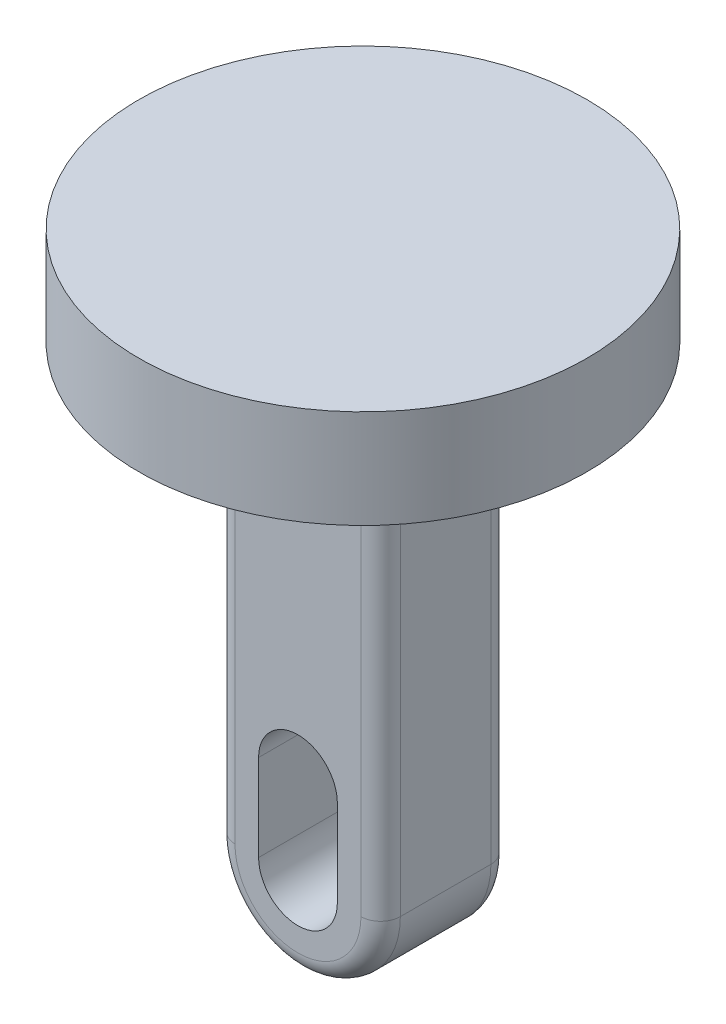
ISO-10303-21;
HEADER;
FILE_DESCRIPTION(('STEP AP214'),'2;1');
FILE_NAME('part.step','',(''),(''),'','','');
FILE_SCHEMA(('AUTOMOTIVE_DESIGN { 1 0 10303 214 1 1 1 1 }'));
ENDSEC;
DATA;
#1=APPLICATION_CONTEXT('core data for automotive mechanical design processes');
#2=APPLICATION_PROTOCOL_DEFINITION('international standard','automotive_design',2000,#1);
#3=PRODUCT_CONTEXT('',#1,'mechanical');
#4=PRODUCT('Part','Part','',(#3));
#5=PRODUCT_RELATED_PRODUCT_CATEGORY('part','',(#4));
#6=PRODUCT_DEFINITION_FORMATION('','',#4);
#7=PRODUCT_DEFINITION_CONTEXT('part definition',#1,'design');
#8=PRODUCT_DEFINITION('design','',#6,#7);
#9=PRODUCT_DEFINITION_SHAPE('','',#8);
#10=(LENGTH_UNIT() NAMED_UNIT(*) SI_UNIT(.MILLI.,.METRE.));
#11=(NAMED_UNIT(*) PLANE_ANGLE_UNIT() SI_UNIT($,.RADIAN.));
#12=(NAMED_UNIT(*) SI_UNIT($,.STERADIAN.) SOLID_ANGLE_UNIT());
#13=UNCERTAINTY_MEASURE_WITH_UNIT(LENGTH_MEASURE(1.E-05),#10,'distance_accuracy_value','');
#14=(GEOMETRIC_REPRESENTATION_CONTEXT(3) GLOBAL_UNCERTAINTY_ASSIGNED_CONTEXT((#13)) GLOBAL_UNIT_ASSIGNED_CONTEXT((#10,
#11,#12)) REPRESENTATION_CONTEXT('',''));
#15=CARTESIAN_POINT('',(0.,0.,0.));
#16=DIRECTION('',(0.,0.,1.));
#17=DIRECTION('',(1.,0.,0.));
#18=AXIS2_PLACEMENT_3D('',#15,#16,#17);
#19=CARTESIAN_POINT('',(0.,0.,1.65));
#20=DIRECTION('',(0.,0.,1.));
#21=DIRECTION('',(1.,0.,0.));
#22=AXIS2_PLACEMENT_3D('',#19,#20,#21);
#23=PLANE('',#22);
#24=CARTESIAN_POINT('',(0.,0.,1.65));
#25=DIRECTION('',(0.,0.,1.));
#26=DIRECTION('',(1.,0.,0.));
#27=AXIS2_PLACEMENT_3D('',#24,#25,#26);
#28=CIRCLE('',#27,1.6);
#29=CARTESIAN_POINT('',(-1.6,0.,1.65));
#30=VERTEX_POINT('',#29);
#31=CARTESIAN_POINT('',(1.6,0.,1.65));
#32=VERTEX_POINT('',#31);
#33=EDGE_CURVE('E185',#30,#32,#28,.T.);
#34=ORIENTED_EDGE('',*,*,#33,.T.);
#35=DIRECTION('',(0.,1.,0.));
#36=VECTOR('',#35,1.);
#37=CARTESIAN_POINT('',(1.6,9.7,1.65));
#38=LINE('',#37,#36);
#39=CARTESIAN_POINT('',(1.6,9.7,1.65));
#40=VERTEX_POINT('',#39);
#41=EDGE_CURVE('E187',#32,#40,#38,.T.);
#42=ORIENTED_EDGE('',*,*,#41,.T.);
#43=DIRECTION('',(-1.,0.,0.));
#44=VECTOR('',#43,1.);
#45=CARTESIAN_POINT('',(2.1,9.7,1.65));
#46=LINE('',#45,#44);
#47=CARTESIAN_POINT('',(-1.6,9.7,1.65));
#48=VERTEX_POINT('',#47);
#49=EDGE_CURVE('E166',#40,#48,#46,.T.);
#50=ORIENTED_EDGE('',*,*,#49,.T.);
#51=DIRECTION('',(0.,-1.,0.));
#52=VECTOR('',#51,1.);
#53=CARTESIAN_POINT('',(-1.6,0.,1.65));
#54=LINE('',#53,#52);
#55=EDGE_CURVE('E183',#48,#30,#54,.T.);
#56=ORIENTED_EDGE('',*,*,#55,.T.);
#57=EDGE_LOOP('',(#34,#42,#50,#56));
#58=FACE_BOUND('',#57,.T.);
#59=DIRECTION('',(0.,1.,0.));
#60=VECTOR('',#59,1.);
#61=CARTESIAN_POINT('',(1.,0.,1.65));
#62=LINE('',#61,#60);
#63=CARTESIAN_POINT('',(1.,0.,1.65));
#64=VERTEX_POINT('',#63);
#65=CARTESIAN_POINT('',(1.,2.2,1.65));
#66=VERTEX_POINT('',#65);
#67=EDGE_CURVE('E133',#64,#66,#62,.T.);
#68=ORIENTED_EDGE('',*,*,#67,.F.);
#69=CARTESIAN_POINT('',(0.,0.,1.65));
#70=DIRECTION('',(0.,0.,1.));
#71=DIRECTION('',(1.,0.,0.));
#72=AXIS2_PLACEMENT_3D('',#69,#70,#71);
#73=CIRCLE('',#72,1.);
#74=CARTESIAN_POINT('',(-1.,0.,1.65));
#75=VERTEX_POINT('',#74);
#76=EDGE_CURVE('E123',#75,#64,#73,.T.);
#77=ORIENTED_EDGE('',*,*,#76,.F.);
#78=DIRECTION('',(0.,-1.,0.));
#79=VECTOR('',#78,1.);
#80=CARTESIAN_POINT('',(-1.,0.,1.65));
#81=LINE('',#80,#79);
#82=CARTESIAN_POINT('',(-1.,2.2,1.65));
#83=VERTEX_POINT('',#82);
#84=EDGE_CURVE('E148',#83,#75,#81,.T.);
#85=ORIENTED_EDGE('',*,*,#84,.F.);
#86=CARTESIAN_POINT('',(0.,2.2,1.65));
#87=DIRECTION('',(0.,0.,1.));
#88=DIRECTION('',(1.,0.,0.));
#89=AXIS2_PLACEMENT_3D('',#86,#87,#88);
#90=CIRCLE('',#89,1.);
#91=EDGE_CURVE('E146',#66,#83,#90,.T.);
#92=ORIENTED_EDGE('',*,*,#91,.F.);
#93=EDGE_LOOP('',(#68,#77,#85,#92));
#94=FACE_BOUND('',#93,.T.);
#95=ADVANCED_FACE('F33',(#58,#94),#23,.T.);
#96=CARTESIAN_POINT('',(0.,0.,-1.65));
#97=DIRECTION('',(0.,0.,1.));
#98=DIRECTION('',(1.,0.,0.));
#99=AXIS2_PLACEMENT_3D('',#96,#97,#98);
#100=PLANE('',#99);
#101=DIRECTION('',(-1.,0.,0.));
#102=VECTOR('',#101,1.);
#103=CARTESIAN_POINT('',(2.1,9.7,-1.65));
#104=LINE('',#103,#102);
#105=CARTESIAN_POINT('',(1.6,9.7,-1.65));
#106=VERTEX_POINT('',#105);
#107=CARTESIAN_POINT('',(-1.6,9.7,-1.65));
#108=VERTEX_POINT('',#107);
#109=EDGE_CURVE('E141',#106,#108,#104,.T.);
#110=ORIENTED_EDGE('',*,*,#109,.F.);
#111=DIRECTION('',(0.,1.,0.));
#112=VECTOR('',#111,1.);
#113=CARTESIAN_POINT('',(1.6,0.,-1.65));
#114=LINE('',#113,#112);
#115=CARTESIAN_POINT('',(1.6,0.,-1.65));
#116=VERTEX_POINT('',#115);
#117=EDGE_CURVE('E50',#106,#116,#114,.F.);
#118=ORIENTED_EDGE('',*,*,#117,.T.);
#119=CARTESIAN_POINT('',(0.,0.,-1.65));
#120=DIRECTION('',(0.,0.,1.));
#121=DIRECTION('',(1.,0.,0.));
#122=AXIS2_PLACEMENT_3D('',#119,#120,#121);
#123=CIRCLE('',#122,1.6);
#124=CARTESIAN_POINT('',(-1.6,0.,-1.65));
#125=VERTEX_POINT('',#124);
#126=EDGE_CURVE('E54',#116,#125,#123,.F.);
#127=ORIENTED_EDGE('',*,*,#126,.T.);
#128=DIRECTION('',(0.,-1.,0.));
#129=VECTOR('',#128,1.);
#130=CARTESIAN_POINT('',(-1.6,0.,-1.65));
#131=LINE('',#130,#129);
#132=EDGE_CURVE('E207',#125,#108,#131,.F.);
#133=ORIENTED_EDGE('',*,*,#132,.T.);
#134=EDGE_LOOP('',(#110,#118,#127,#133));
#135=FACE_BOUND('',#134,.T.);
#136=CARTESIAN_POINT('',(0.,0.,-1.65));
#137=DIRECTION('',(0.,0.,1.));
#138=DIRECTION('',(1.,0.,0.));
#139=AXIS2_PLACEMENT_3D('',#136,#137,#138);
#140=CIRCLE('',#139,1.);
#141=CARTESIAN_POINT('',(-1.,0.,-1.65));
#142=VERTEX_POINT('',#141);
#143=CARTESIAN_POINT('',(1.,0.,-1.65));
#144=VERTEX_POINT('',#143);
#145=EDGE_CURVE('E153',#142,#144,#140,.T.);
#146=ORIENTED_EDGE('',*,*,#145,.T.);
#147=DIRECTION('',(0.,1.,0.));
#148=VECTOR('',#147,1.);
#149=CARTESIAN_POINT('',(1.,0.,-1.65));
#150=LINE('',#149,#148);
#151=CARTESIAN_POINT('',(1.,2.2,-1.65));
#152=VERTEX_POINT('',#151);
#153=EDGE_CURVE('E140',#144,#152,#150,.T.);
#154=ORIENTED_EDGE('',*,*,#153,.T.);
#155=CARTESIAN_POINT('',(0.,2.2,-1.65));
#156=DIRECTION('',(0.,0.,1.));
#157=DIRECTION('',(1.,0.,0.));
#158=AXIS2_PLACEMENT_3D('',#155,#156,#157);
#159=CIRCLE('',#158,1.);
#160=CARTESIAN_POINT('',(-1.,2.2,-1.65));
#161=VERTEX_POINT('',#160);
#162=EDGE_CURVE('E157',#152,#161,#159,.T.);
#163=ORIENTED_EDGE('',*,*,#162,.T.);
#164=DIRECTION('',(0.,-1.,0.));
#165=VECTOR('',#164,1.);
#166=CARTESIAN_POINT('',(-1.,0.,-1.65));
#167=LINE('',#166,#165);
#168=EDGE_CURVE('E134',#161,#142,#167,.T.);
#169=ORIENTED_EDGE('',*,*,#168,.T.);
#170=EDGE_LOOP('',(#146,#154,#163,#169));
#171=FACE_BOUND('',#170,.T.);
#172=ADVANCED_FACE('F231',(#135,#171),#100,.F.);
#173=CARTESIAN_POINT('',(-2.1,0.,1.65));
#174=DIRECTION('',(1.,0.,0.));
#175=DIRECTION('',(0.,0.,-1.));
#176=AXIS2_PLACEMENT_3D('',#173,#174,#175);
#177=PLANE('',#176);
#178=DIRECTION('',(0.,0.,-1.));
#179=VECTOR('',#178,1.);
#180=CARTESIAN_POINT('',(-2.1,0.,1.65));
#181=LINE('',#180,#179);
#182=CARTESIAN_POINT('',(-2.1,0.,1.15));
#183=VERTEX_POINT('',#182);
#184=CARTESIAN_POINT('',(-2.1,0.,-1.15));
#185=VERTEX_POINT('',#184);
#186=EDGE_CURVE('E180',#183,#185,#181,.T.);
#187=ORIENTED_EDGE('',*,*,#186,.F.);
#188=DIRECTION('',(0.,-1.,0.));
#189=VECTOR('',#188,1.);
#190=CARTESIAN_POINT('',(-2.1,9.7,1.15));
#191=LINE('',#190,#189);
#192=CARTESIAN_POINT('',(-2.1,9.7,1.15));
#193=VERTEX_POINT('',#192);
#194=EDGE_CURVE('E11',#183,#193,#191,.F.);
#195=ORIENTED_EDGE('',*,*,#194,.T.);
#196=DIRECTION('',(0.,0.,-1.));
#197=VECTOR('',#196,1.);
#198=CARTESIAN_POINT('',(-2.1,9.7,1.65));
#199=LINE('',#198,#197);
#200=CARTESIAN_POINT('',(-2.1,9.7,-1.15));
#201=VERTEX_POINT('',#200);
#202=EDGE_CURVE('E169',#193,#201,#199,.T.);
#203=ORIENTED_EDGE('',*,*,#202,.T.);
#204=DIRECTION('',(0.,-1.,0.));
#205=VECTOR('',#204,1.);
#206=CARTESIAN_POINT('',(-2.1,0.,-1.15));
#207=LINE('',#206,#205);
#208=EDGE_CURVE('E42',#201,#185,#207,.T.);
#209=ORIENTED_EDGE('',*,*,#208,.T.);
#210=EDGE_LOOP('',(#187,#195,#203,#209));
#211=FACE_BOUND('',#210,.T.);
#212=ADVANCED_FACE('F262',(#211),#177,.F.);
#213=CARTESIAN_POINT('',(0.,0.,1.65));
#214=DIRECTION('',(0.,0.,-1.));
#215=DIRECTION('',(-1.,0.,0.));
#216=AXIS2_PLACEMENT_3D('',#213,#214,#215);
#217=CYLINDRICAL_SURFACE('',#216,2.1);
#218=DIRECTION('',(0.,0.,-1.));
#219=VECTOR('',#218,1.);
#220=CARTESIAN_POINT('',(2.1,0.,1.65));
#221=LINE('',#220,#219);
#222=CARTESIAN_POINT('',(2.1,0.,1.15));
#223=VERTEX_POINT('',#222);
#224=CARTESIAN_POINT('',(2.1,0.,-1.15));
#225=VERTEX_POINT('',#224);
#226=EDGE_CURVE('E177',#223,#225,#221,.T.);
#227=ORIENTED_EDGE('',*,*,#226,.F.);
#228=CARTESIAN_POINT('',(0.,0.,1.15));
#229=DIRECTION('',(0.,0.,1.));
#230=DIRECTION('',(1.,0.,0.));
#231=AXIS2_PLACEMENT_3D('',#228,#229,#230);
#232=CIRCLE('',#231,2.1);
#233=EDGE_CURVE('E205',#223,#183,#232,.F.);
#234=ORIENTED_EDGE('',*,*,#233,.T.);
#235=ORIENTED_EDGE('',*,*,#186,.T.);
#236=CARTESIAN_POINT('',(0.,0.,-1.15));
#237=DIRECTION('',(0.,0.,1.));
#238=DIRECTION('',(1.,0.,0.));
#239=AXIS2_PLACEMENT_3D('',#236,#237,#238);
#240=CIRCLE('',#239,2.1);
#241=EDGE_CURVE('E203',#185,#225,#240,.T.);
#242=ORIENTED_EDGE('',*,*,#241,.T.);
#243=EDGE_LOOP('',(#227,#234,#235,#242));
#244=FACE_BOUND('',#243,.T.);
#245=ADVANCED_FACE('F245',(#244),#217,.T.);
#246=CARTESIAN_POINT('',(2.1,0.,1.65));
#247=DIRECTION('',(-1.,0.,0.));
#248=DIRECTION('',(0.,0.,1.));
#249=AXIS2_PLACEMENT_3D('',#246,#247,#248);
#250=PLANE('',#249);
#251=DIRECTION('',(0.,0.,-1.));
#252=VECTOR('',#251,1.);
#253=CARTESIAN_POINT('',(2.1,9.7,1.65));
#254=LINE('',#253,#252);
#255=CARTESIAN_POINT('',(2.1,9.7,1.15));
#256=VERTEX_POINT('',#255);
#257=CARTESIAN_POINT('',(2.1,9.7,-1.15));
#258=VERTEX_POINT('',#257);
#259=EDGE_CURVE('E174',#256,#258,#254,.T.);
#260=ORIENTED_EDGE('',*,*,#259,.F.);
#261=DIRECTION('',(0.,1.,0.));
#262=VECTOR('',#261,1.);
#263=CARTESIAN_POINT('',(2.1,0.,1.15));
#264=LINE('',#263,#262);
#265=EDGE_CURVE('E201',#256,#223,#264,.F.);
#266=ORIENTED_EDGE('',*,*,#265,.T.);
#267=ORIENTED_EDGE('',*,*,#226,.T.);
#268=DIRECTION('',(0.,1.,0.));
#269=VECTOR('',#268,1.);
#270=CARTESIAN_POINT('',(2.1,0.,-1.15));
#271=LINE('',#270,#269);
#272=EDGE_CURVE('E198',#225,#258,#271,.T.);
#273=ORIENTED_EDGE('',*,*,#272,.T.);
#274=EDGE_LOOP('',(#260,#266,#267,#273));
#275=FACE_BOUND('',#274,.T.);
#276=ADVANCED_FACE('F240',(#275),#250,.F.);
#277=CARTESIAN_POINT('',(2.1,9.7,1.65));
#278=DIRECTION('',(0.,-1.,0.));
#279=DIRECTION('',(0.,0.,-1.));
#280=AXIS2_PLACEMENT_3D('',#277,#278,#279);
#281=PLANE('',#280);
#282=CARTESIAN_POINT('',(0.,9.7,0.));
#283=DIRECTION('',(0.,-1.,0.));
#284=DIRECTION('',(0.,0.,-1.));
#285=AXIS2_PLACEMENT_3D('',#282,#283,#284);
#286=CIRCLE('',#285,1.62);
#287=CARTESIAN_POINT('',(0.,9.7,-1.62));
#288=VERTEX_POINT('',#287);
#289=EDGE_CURVE('E217',#288,#288,#286,.T.);
#290=ORIENTED_EDGE('',*,*,#289,.T.);
#291=EDGE_LOOP('',(#290));
#292=FACE_BOUND('',#291,.T.);
#293=ORIENTED_EDGE('',*,*,#49,.F.);
#294=CARTESIAN_POINT('',(1.6,9.7,1.15));
#295=DIRECTION('',(0.,-1.,0.));
#296=DIRECTION('',(0.,0.,-1.));
#297=AXIS2_PLACEMENT_3D('',#294,#295,#296);
#298=CIRCLE('',#297,0.5);
#299=EDGE_CURVE('E196',#40,#256,#298,.F.);
#300=ORIENTED_EDGE('',*,*,#299,.T.);
#301=ORIENTED_EDGE('',*,*,#259,.T.);
#302=CARTESIAN_POINT('',(1.6,9.7,-1.15));
#303=DIRECTION('',(0.,-1.,0.));
#304=DIRECTION('',(0.,0.,-1.));
#305=AXIS2_PLACEMENT_3D('',#302,#303,#304);
#306=CIRCLE('',#305,0.5);
#307=EDGE_CURVE('E194',#258,#106,#306,.F.);
#308=ORIENTED_EDGE('',*,*,#307,.T.);
#309=ORIENTED_EDGE('',*,*,#109,.T.);
#310=CARTESIAN_POINT('',(-1.6,9.7,-1.15));
#311=DIRECTION('',(0.,-1.,0.));
#312=DIRECTION('',(0.,0.,-1.));
#313=AXIS2_PLACEMENT_3D('',#310,#311,#312);
#314=CIRCLE('',#313,0.5);
#315=EDGE_CURVE('E190',#108,#201,#314,.F.);
#316=ORIENTED_EDGE('',*,*,#315,.T.);
#317=ORIENTED_EDGE('',*,*,#202,.F.);
#318=CARTESIAN_POINT('',(-1.6,9.7,1.15));
#319=DIRECTION('',(0.,-1.,0.));
#320=DIRECTION('',(0.,0.,-1.));
#321=AXIS2_PLACEMENT_3D('',#318,#319,#320);
#322=CIRCLE('',#321,0.5);
#323=EDGE_CURVE('E192',#193,#48,#322,.F.);
#324=ORIENTED_EDGE('',*,*,#323,.T.);
#325=EDGE_LOOP('',(#293,#300,#301,#308,#309,#316,#317,#324));
#326=FACE_BOUND('',#325,.T.);
#327=ADVANCED_FACE('F235',(#292,#326),#281,.F.);
#328=CARTESIAN_POINT('',(0.,0.,1.65));
#329=DIRECTION('',(0.,0.,-1.));
#330=DIRECTION('',(-1.,0.,0.));
#331=AXIS2_PLACEMENT_3D('',#328,#329,#330);
#332=CYLINDRICAL_SURFACE('',#331,1.);
#333=ORIENTED_EDGE('',*,*,#145,.F.);
#334=DIRECTION('',(0.,0.,-1.));
#335=VECTOR('',#334,1.);
#336=CARTESIAN_POINT('',(-1.,0.,1.65));
#337=LINE('',#336,#335);
#338=EDGE_CURVE('E129',#75,#142,#337,.T.);
#339=ORIENTED_EDGE('',*,*,#338,.F.);
#340=ORIENTED_EDGE('',*,*,#76,.T.);
#341=DIRECTION('',(0.,0.,-1.));
#342=VECTOR('',#341,1.);
#343=CARTESIAN_POINT('',(1.,0.,1.65));
#344=LINE('',#343,#342);
#345=EDGE_CURVE('E126',#64,#144,#344,.T.);
#346=ORIENTED_EDGE('',*,*,#345,.T.);
#347=EDGE_LOOP('',(#333,#339,#340,#346));
#348=FACE_BOUND('',#347,.T.);
#349=ADVANCED_FACE('F125',(#348),#332,.F.);
#350=CARTESIAN_POINT('',(1.,0.,1.65));
#351=DIRECTION('',(-1.,0.,0.));
#352=DIRECTION('',(0.,0.,1.));
#353=AXIS2_PLACEMENT_3D('',#350,#351,#352);
#354=PLANE('',#353);
#355=ORIENTED_EDGE('',*,*,#153,.F.);
#356=ORIENTED_EDGE('',*,*,#345,.F.);
#357=ORIENTED_EDGE('',*,*,#67,.T.);
#358=DIRECTION('',(0.,0.,-1.));
#359=VECTOR('',#358,1.);
#360=CARTESIAN_POINT('',(1.,2.2,1.65));
#361=LINE('',#360,#359);
#362=EDGE_CURVE('E142',#66,#152,#361,.T.);
#363=ORIENTED_EDGE('',*,*,#362,.T.);
#364=EDGE_LOOP('',(#355,#356,#357,#363));
#365=FACE_BOUND('',#364,.T.);
#366=ADVANCED_FACE('F137',(#365),#354,.T.);
#367=CARTESIAN_POINT('',(0.,2.2,1.65));
#368=DIRECTION('',(0.,0.,-1.));
#369=DIRECTION('',(-1.,0.,0.));
#370=AXIS2_PLACEMENT_3D('',#367,#368,#369);
#371=CYLINDRICAL_SURFACE('',#370,1.);
#372=ORIENTED_EDGE('',*,*,#162,.F.);
#373=ORIENTED_EDGE('',*,*,#362,.F.);
#374=ORIENTED_EDGE('',*,*,#91,.T.);
#375=DIRECTION('',(0.,0.,-1.));
#376=VECTOR('',#375,1.);
#377=CARTESIAN_POINT('',(-1.,2.2,1.65));
#378=LINE('',#377,#376);
#379=EDGE_CURVE('E163',#83,#161,#378,.T.);
#380=ORIENTED_EDGE('',*,*,#379,.T.);
#381=EDGE_LOOP('',(#372,#373,#374,#380));
#382=FACE_BOUND('',#381,.T.);
#383=ADVANCED_FACE('F303',(#382),#371,.F.);
#384=CARTESIAN_POINT('',(-1.,0.,1.65));
#385=DIRECTION('',(1.,0.,0.));
#386=DIRECTION('',(0.,0.,-1.));
#387=AXIS2_PLACEMENT_3D('',#384,#385,#386);
#388=PLANE('',#387);
#389=ORIENTED_EDGE('',*,*,#168,.F.);
#390=ORIENTED_EDGE('',*,*,#379,.F.);
#391=ORIENTED_EDGE('',*,*,#84,.T.);
#392=ORIENTED_EDGE('',*,*,#338,.T.);
#393=EDGE_LOOP('',(#389,#390,#391,#392));
#394=FACE_BOUND('',#393,.T.);
#395=ADVANCED_FACE('F309',(#394),#388,.T.);
#396=CARTESIAN_POINT('',(0.,13.5,0.));
#397=DIRECTION('',(0.,1.,0.));
#398=DIRECTION('',(0.,0.,1.));
#399=AXIS2_PLACEMENT_3D('',#396,#397,#398);
#400=PLANE('',#399);
#401=CARTESIAN_POINT('',(0.,13.5,0.));
#402=DIRECTION('',(0.,-1.,0.));
#403=DIRECTION('',(0.,0.,-1.));
#404=AXIS2_PLACEMENT_3D('',#401,#402,#403);
#405=CIRCLE('',#404,5.69);
#406=CARTESIAN_POINT('',(0.,13.5,-5.69));
#407=VERTEX_POINT('',#406);
#408=EDGE_CURVE('E155',#407,#407,#405,.T.);
#409=ORIENTED_EDGE('',*,*,#408,.F.);
#410=EDGE_LOOP('',(#409));
#411=FACE_BOUND('',#410,.T.);
#412=ADVANCED_FACE('F317',(#411),#400,.T.);
#413=CARTESIAN_POINT('',(0.,9.7,0.));
#414=DIRECTION('',(0.,-1.,0.));
#415=DIRECTION('',(0.,0.,-1.));
#416=AXIS2_PLACEMENT_3D('',#413,#414,#415);
#417=CYLINDRICAL_SURFACE('',#416,5.69);
#418=ORIENTED_EDGE('',*,*,#408,.T.);
#419=EDGE_LOOP('',(#418));
#420=FACE_BOUND('',#419,.T.);
#421=CARTESIAN_POINT('',(0.,11.,0.));
#422=DIRECTION('',(0.,-1.,0.));
#423=DIRECTION('',(0.,0.,-1.));
#424=AXIS2_PLACEMENT_3D('',#421,#422,#423);
#425=CIRCLE('',#424,5.69);
#426=CARTESIAN_POINT('',(0.,11.,-5.69));
#427=VERTEX_POINT('',#426);
#428=EDGE_CURVE('E441',#427,#427,#425,.T.);
#429=ORIENTED_EDGE('',*,*,#428,.F.);
#430=EDGE_LOOP('',(#429));
#431=FACE_BOUND('',#430,.T.);
#432=ADVANCED_FACE('F325',(#420,#431),#417,.T.);
#433=CARTESIAN_POINT('',(5.69,11.,0.));
#434=DIRECTION('',(0.,-1.,0.));
#435=DIRECTION('',(0.,0.,-1.));
#436=AXIS2_PLACEMENT_3D('',#433,#434,#435);
#437=PLANE('',#436);
#438=ORIENTED_EDGE('',*,*,#428,.T.);
#439=EDGE_LOOP('',(#438));
#440=FACE_BOUND('',#439,.T.);
#441=CARTESIAN_POINT('',(0.,11.,0.));
#442=DIRECTION('',(0.,-1.,0.));
#443=DIRECTION('',(0.,0.,-1.));
#444=AXIS2_PLACEMENT_3D('',#441,#442,#443);
#445=CIRCLE('',#444,1.62);
#446=CARTESIAN_POINT('',(0.,11.,-1.62));
#447=VERTEX_POINT('',#446);
#448=EDGE_CURVE('E437',#447,#447,#445,.T.);
#449=ORIENTED_EDGE('',*,*,#448,.F.);
#450=EDGE_LOOP('',(#449));
#451=FACE_BOUND('',#450,.T.);
#452=ADVANCED_FACE('F333',(#440,#451),#437,.T.);
#453=CARTESIAN_POINT('',(0.,9.7,0.));
#454=DIRECTION('',(0.,-1.,0.));
#455=DIRECTION('',(0.,0.,-1.));
#456=AXIS2_PLACEMENT_3D('',#453,#454,#455);
#457=CYLINDRICAL_SURFACE('',#456,1.62);
#458=ORIENTED_EDGE('',*,*,#448,.T.);
#459=EDGE_LOOP('',(#458));
#460=FACE_BOUND('',#459,.T.);
#461=ORIENTED_EDGE('',*,*,#289,.F.);
#462=EDGE_LOOP('',(#461));
#463=FACE_BOUND('',#462,.T.);
#464=ADVANCED_FACE('F341',(#460,#463),#457,.T.);
#465=CARTESIAN_POINT('',(-1.6,0.,1.15));
#466=DIRECTION('',(0.,1.,0.));
#467=DIRECTION('',(0.,0.,1.));
#468=AXIS2_PLACEMENT_3D('',#465,#466,#467);
#469=CYLINDRICAL_SURFACE('',#468,0.5);
#470=ORIENTED_EDGE('',*,*,#323,.F.);
#471=ORIENTED_EDGE('',*,*,#194,.F.);
#472=CARTESIAN_POINT('',(-1.6,0.,1.15));
#473=DIRECTION('',(0.,-1.,0.));
#474=DIRECTION('',(1.,0.,0.));
#475=AXIS2_PLACEMENT_3D('',#472,#473,#474);
#476=CIRCLE('',#475,0.5);
#477=EDGE_CURVE('E215',#30,#183,#476,.T.);
#478=ORIENTED_EDGE('',*,*,#477,.F.);
#479=ORIENTED_EDGE('',*,*,#55,.F.);
#480=EDGE_LOOP('',(#470,#471,#478,#479));
#481=FACE_BOUND('',#480,.T.);
#482=ADVANCED_FACE('F260',(#481),#469,.T.);
#483=CARTESIAN_POINT('',(0.,0.,1.15));
#484=DIRECTION('',(0.,0.,1.));
#485=DIRECTION('',(1.,0.,0.));
#486=AXIS2_PLACEMENT_3D('',#483,#484,#485);
#487=TOROIDAL_SURFACE('',#486,1.6,0.5);
#488=ORIENTED_EDGE('',*,*,#477,.T.);
#489=ORIENTED_EDGE('',*,*,#233,.F.);
#490=CARTESIAN_POINT('',(1.6,0.,1.15));
#491=DIRECTION('',(0.,1.,0.));
#492=DIRECTION('',(0.,0.,1.));
#493=AXIS2_PLACEMENT_3D('',#490,#491,#492);
#494=CIRCLE('',#493,0.5);
#495=EDGE_CURVE('E212',#32,#223,#494,.T.);
#496=ORIENTED_EDGE('',*,*,#495,.F.);
#497=ORIENTED_EDGE('',*,*,#33,.F.);
#498=EDGE_LOOP('',(#488,#489,#496,#497));
#499=FACE_BOUND('',#498,.T.);
#500=ADVANCED_FACE('F249',(#499),#487,.T.);
#501=CARTESIAN_POINT('',(1.6,0.,1.15));
#502=DIRECTION('',(0.,-1.,0.));
#503=DIRECTION('',(0.,0.,-1.));
#504=AXIS2_PLACEMENT_3D('',#501,#502,#503);
#505=CYLINDRICAL_SURFACE('',#504,0.5);
#506=ORIENTED_EDGE('',*,*,#495,.T.);
#507=ORIENTED_EDGE('',*,*,#265,.F.);
#508=ORIENTED_EDGE('',*,*,#299,.F.);
#509=ORIENTED_EDGE('',*,*,#41,.F.);
#510=EDGE_LOOP('',(#506,#507,#508,#509));
#511=FACE_BOUND('',#510,.T.);
#512=ADVANCED_FACE('F254',(#511),#505,.T.);
#513=CARTESIAN_POINT('',(-1.6,0.,-1.15));
#514=DIRECTION('',(0.,-1.,0.));
#515=DIRECTION('',(0.,0.,-1.));
#516=AXIS2_PLACEMENT_3D('',#513,#514,#515);
#517=CYLINDRICAL_SURFACE('',#516,0.5);
#518=ORIENTED_EDGE('',*,*,#315,.F.);
#519=ORIENTED_EDGE('',*,*,#132,.F.);
#520=CARTESIAN_POINT('',(-1.6,0.,-1.15));
#521=DIRECTION('',(0.,-1.,0.));
#522=DIRECTION('',(0.,0.,-1.));
#523=AXIS2_PLACEMENT_3D('',#520,#521,#522);
#524=CIRCLE('',#523,0.5);
#525=EDGE_CURVE('E37',#185,#125,#524,.T.);
#526=ORIENTED_EDGE('',*,*,#525,.F.);
#527=ORIENTED_EDGE('',*,*,#208,.F.);
#528=EDGE_LOOP('',(#518,#519,#526,#527));
#529=FACE_BOUND('',#528,.T.);
#530=ADVANCED_FACE('F35',(#529),#517,.T.);
#531=CARTESIAN_POINT('',(0.,0.,-1.15));
#532=DIRECTION('',(0.,0.,1.));
#533=DIRECTION('',(1.,0.,0.));
#534=AXIS2_PLACEMENT_3D('',#531,#532,#533);
#535=TOROIDAL_SURFACE('',#534,1.6,0.5);
#536=ORIENTED_EDGE('',*,*,#525,.T.);
#537=ORIENTED_EDGE('',*,*,#126,.F.);
#538=CARTESIAN_POINT('',(1.6,0.,-1.15));
#539=DIRECTION('',(0.,1.,0.));
#540=DIRECTION('',(0.,0.,1.));
#541=AXIS2_PLACEMENT_3D('',#538,#539,#540);
#542=CIRCLE('',#541,0.5);
#543=EDGE_CURVE('E218',#225,#116,#542,.T.);
#544=ORIENTED_EDGE('',*,*,#543,.F.);
#545=ORIENTED_EDGE('',*,*,#241,.F.);
#546=EDGE_LOOP('',(#536,#537,#544,#545));
#547=FACE_BOUND('',#546,.T.);
#548=ADVANCED_FACE('F227',(#547),#535,.T.);
#549=CARTESIAN_POINT('',(1.6,0.,-1.15));
#550=DIRECTION('',(0.,1.,0.));
#551=DIRECTION('',(0.,0.,1.));
#552=AXIS2_PLACEMENT_3D('',#549,#550,#551);
#553=CYLINDRICAL_SURFACE('',#552,0.5);
#554=ORIENTED_EDGE('',*,*,#543,.T.);
#555=ORIENTED_EDGE('',*,*,#117,.F.);
#556=ORIENTED_EDGE('',*,*,#307,.F.);
#557=ORIENTED_EDGE('',*,*,#272,.F.);
#558=EDGE_LOOP('',(#554,#555,#556,#557));
#559=FACE_BOUND('',#558,.T.);
#560=ADVANCED_FACE('F238',(#559),#553,.T.);
#561=CLOSED_SHELL('',(#95,#172,#212,#245,#276,#327,#349,#366,#383,#395,#412,#432,#452,#464,#482,
#500,#512,#530,#548,#560));
#562=MANIFOLD_SOLID_BREP('B2',#561);
#563=ADVANCED_BREP_SHAPE_REPRESENTATION('',(#18,#562),#14);
#564=SHAPE_DEFINITION_REPRESENTATION(#9,#563);
ENDSEC;
END-ISO-10303-21;
